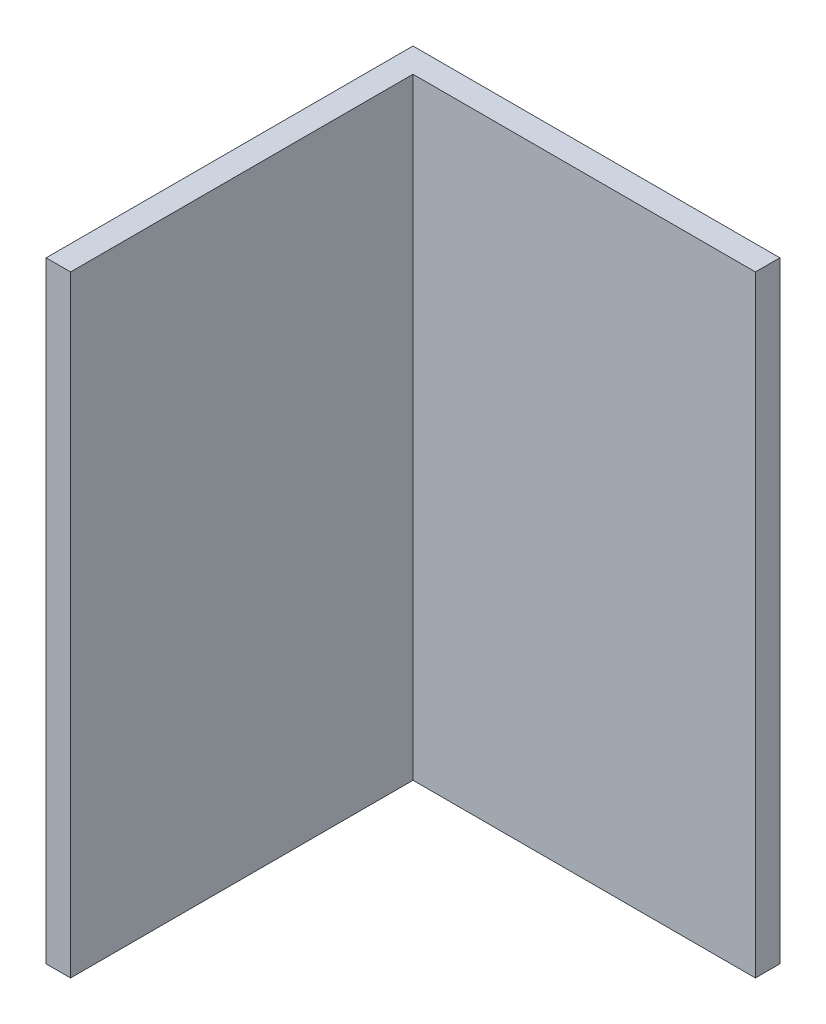
ISO-10303-21;
HEADER;
FILE_DESCRIPTION(('STEP AP214'),'2;1');
FILE_NAME('part.step','',(''),(''),'','','');
FILE_SCHEMA(('AUTOMOTIVE_DESIGN { 1 0 10303 214 1 1 1 1 }'));
ENDSEC;
DATA;
#1=APPLICATION_CONTEXT('core data for automotive mechanical design processes');
#2=APPLICATION_PROTOCOL_DEFINITION('international standard','automotive_design',2000,#1);
#3=PRODUCT_CONTEXT('',#1,'mechanical');
#4=PRODUCT('Part','Part','',(#3));
#5=PRODUCT_RELATED_PRODUCT_CATEGORY('part','',(#4));
#6=PRODUCT_DEFINITION_FORMATION('','',#4);
#7=PRODUCT_DEFINITION_CONTEXT('part definition',#1,'design');
#8=PRODUCT_DEFINITION('design','',#6,#7);
#9=PRODUCT_DEFINITION_SHAPE('','',#8);
#10=(LENGTH_UNIT() NAMED_UNIT(*) SI_UNIT(.MILLI.,.METRE.));
#11=(NAMED_UNIT(*) PLANE_ANGLE_UNIT() SI_UNIT($,.RADIAN.));
#12=(NAMED_UNIT(*) SI_UNIT($,.STERADIAN.) SOLID_ANGLE_UNIT());
#13=UNCERTAINTY_MEASURE_WITH_UNIT(LENGTH_MEASURE(1.E-05),#10,'distance_accuracy_value','');
#14=(GEOMETRIC_REPRESENTATION_CONTEXT(3) GLOBAL_UNCERTAINTY_ASSIGNED_CONTEXT((#13)) GLOBAL_UNIT_ASSIGNED_CONTEXT((#10,
#11,#12)) REPRESENTATION_CONTEXT('',''));
#15=CARTESIAN_POINT('',(0.,0.,0.));
#16=DIRECTION('',(0.,0.,1.));
#17=DIRECTION('',(1.,0.,0.));
#18=AXIS2_PLACEMENT_3D('',#15,#16,#17);
#19=CARTESIAN_POINT('',(0.,0.,2.));
#20=DIRECTION('',(0.,0.,-1.));
#21=DIRECTION('',(-1.,0.,0.));
#22=AXIS2_PLACEMENT_3D('',#19,#20,#21);
#23=PLANE('',#22);
#24=DIRECTION('',(0.,1.,0.));
#25=VECTOR('',#24,1.);
#26=CARTESIAN_POINT('',(2.,50.,2.));
#27=LINE('',#26,#25);
#28=CARTESIAN_POINT('',(2.,0.,2.));
#29=VERTEX_POINT('',#28);
#30=CARTESIAN_POINT('',(2.,50.,2.));
#31=VERTEX_POINT('',#30);
#32=EDGE_CURVE('E48',#29,#31,#27,.T.);
#33=ORIENTED_EDGE('',*,*,#32,.F.);
#34=DIRECTION('',(1.,0.,0.));
#35=VECTOR('',#34,1.);
#36=CARTESIAN_POINT('',(0.,0.,2.));
#37=LINE('',#36,#35);
#38=CARTESIAN_POINT('',(30.,0.,2.));
#39=VERTEX_POINT('',#38);
#40=EDGE_CURVE('E85',#29,#39,#37,.T.);
#41=ORIENTED_EDGE('',*,*,#40,.T.);
#42=DIRECTION('',(0.,1.,0.));
#43=VECTOR('',#42,1.);
#44=CARTESIAN_POINT('',(30.,0.,2.));
#45=LINE('',#44,#43);
#46=CARTESIAN_POINT('',(30.,50.,2.));
#47=VERTEX_POINT('',#46);
#48=EDGE_CURVE('E54',#39,#47,#45,.T.);
#49=ORIENTED_EDGE('',*,*,#48,.T.);
#50=DIRECTION('',(-1.,0.,0.));
#51=VECTOR('',#50,1.);
#52=CARTESIAN_POINT('',(0.,50.,2.));
#53=LINE('',#52,#51);
#54=EDGE_CURVE('E95',#47,#31,#53,.T.);
#55=ORIENTED_EDGE('',*,*,#54,.T.);
#56=EDGE_LOOP('',(#33,#41,#49,#55));
#57=FACE_BOUND('',#56,.T.);
#58=ADVANCED_FACE('F33',(#57),#23,.F.);
#59=CARTESIAN_POINT('',(0.,0.,2.));
#60=DIRECTION('',(1.,0.,0.));
#61=DIRECTION('',(0.,0.,-1.));
#62=AXIS2_PLACEMENT_3D('',#59,#60,#61);
#63=PLANE('',#62);
#64=DIRECTION('',(0.,-1.,0.));
#65=VECTOR('',#64,1.);
#66=CARTESIAN_POINT('',(0.,0.,0.));
#67=LINE('',#66,#65);
#68=CARTESIAN_POINT('',(0.,50.,0.));
#69=VERTEX_POINT('',#68);
#70=CARTESIAN_POINT('',(0.,0.,0.));
#71=VERTEX_POINT('',#70);
#72=EDGE_CURVE('E92',#69,#71,#67,.T.);
#73=ORIENTED_EDGE('',*,*,#72,.T.);
#74=DIRECTION('',(0.,0.,-1.));
#75=VECTOR('',#74,1.);
#76=CARTESIAN_POINT('',(0.,0.,2.));
#77=LINE('',#76,#75);
#78=CARTESIAN_POINT('',(0.,0.,30.));
#79=VERTEX_POINT('',#78);
#80=EDGE_CURVE('E11',#79,#71,#77,.T.);
#81=ORIENTED_EDGE('',*,*,#80,.F.);
#82=DIRECTION('',(0.,-1.,0.));
#83=VECTOR('',#82,1.);
#84=CARTESIAN_POINT('',(0.,50.,30.));
#85=LINE('',#84,#83);
#86=CARTESIAN_POINT('',(0.,50.,30.));
#87=VERTEX_POINT('',#86);
#88=EDGE_CURVE('E94',#87,#79,#85,.T.);
#89=ORIENTED_EDGE('',*,*,#88,.F.);
#90=DIRECTION('',(0.,0.,-1.));
#91=VECTOR('',#90,1.);
#92=CARTESIAN_POINT('',(0.,50.,2.));
#93=LINE('',#92,#91);
#94=EDGE_CURVE('E78',#87,#69,#93,.T.);
#95=ORIENTED_EDGE('',*,*,#94,.T.);
#96=EDGE_LOOP('',(#73,#81,#89,#95));
#97=FACE_BOUND('',#96,.T.);
#98=ADVANCED_FACE('F35',(#97),#63,.F.);
#99=CARTESIAN_POINT('',(0.,0.,2.));
#100=DIRECTION('',(0.,1.,0.));
#101=DIRECTION('',(0.,0.,1.));
#102=AXIS2_PLACEMENT_3D('',#99,#100,#101);
#103=PLANE('',#102);
#104=DIRECTION('',(1.,0.,0.));
#105=VECTOR('',#104,1.);
#106=CARTESIAN_POINT('',(0.,0.,0.));
#107=LINE('',#106,#105);
#108=CARTESIAN_POINT('',(30.,0.,0.));
#109=VERTEX_POINT('',#108);
#110=EDGE_CURVE('E98',#71,#109,#107,.T.);
#111=ORIENTED_EDGE('',*,*,#110,.T.);
#112=DIRECTION('',(0.,0.,-1.));
#113=VECTOR('',#112,1.);
#114=CARTESIAN_POINT('',(30.,0.,2.));
#115=LINE('',#114,#113);
#116=EDGE_CURVE('E41',#39,#109,#115,.T.);
#117=ORIENTED_EDGE('',*,*,#116,.F.);
#118=ORIENTED_EDGE('',*,*,#40,.F.);
#119=DIRECTION('',(0.,0.,-1.));
#120=VECTOR('',#119,1.);
#121=CARTESIAN_POINT('',(2.00000000000001,0.,30.));
#122=LINE('',#121,#120);
#123=CARTESIAN_POINT('',(2.00000000000001,0.,30.));
#124=VERTEX_POINT('',#123);
#125=EDGE_CURVE('E99',#124,#29,#122,.T.);
#126=ORIENTED_EDGE('',*,*,#125,.F.);
#127=DIRECTION('',(1.,0.,0.));
#128=VECTOR('',#127,1.);
#129=CARTESIAN_POINT('',(0.,0.,30.));
#130=LINE('',#129,#128);
#131=EDGE_CURVE('E119',#79,#124,#130,.T.);
#132=ORIENTED_EDGE('',*,*,#131,.F.);
#133=ORIENTED_EDGE('',*,*,#80,.T.);
#134=EDGE_LOOP('',(#111,#117,#118,#126,#132,#133));
#135=FACE_BOUND('',#134,.T.);
#136=ADVANCED_FACE('F114',(#135),#103,.F.);
#137=CARTESIAN_POINT('',(30.,0.,2.));
#138=DIRECTION('',(-1.,0.,0.));
#139=DIRECTION('',(0.,0.,1.));
#140=AXIS2_PLACEMENT_3D('',#137,#138,#139);
#141=PLANE('',#140);
#142=DIRECTION('',(0.,1.,0.));
#143=VECTOR('',#142,1.);
#144=CARTESIAN_POINT('',(30.,0.,0.));
#145=LINE('',#144,#143);
#146=CARTESIAN_POINT('',(30.,50.,0.));
#147=VERTEX_POINT('',#146);
#148=EDGE_CURVE('E86',#109,#147,#145,.T.);
#149=ORIENTED_EDGE('',*,*,#148,.T.);
#150=DIRECTION('',(0.,0.,-1.));
#151=VECTOR('',#150,1.);
#152=CARTESIAN_POINT('',(30.,50.,2.));
#153=LINE('',#152,#151);
#154=EDGE_CURVE('E81',#47,#147,#153,.T.);
#155=ORIENTED_EDGE('',*,*,#154,.F.);
#156=ORIENTED_EDGE('',*,*,#48,.F.);
#157=ORIENTED_EDGE('',*,*,#116,.T.);
#158=EDGE_LOOP('',(#149,#155,#156,#157));
#159=FACE_BOUND('',#158,.T.);
#160=ADVANCED_FACE('F112',(#159),#141,.F.);
#161=CARTESIAN_POINT('',(0.,50.,2.));
#162=DIRECTION('',(0.,-1.,0.));
#163=DIRECTION('',(0.,0.,-1.));
#164=AXIS2_PLACEMENT_3D('',#161,#162,#163);
#165=PLANE('',#164);
#166=DIRECTION('',(-1.,0.,0.));
#167=VECTOR('',#166,1.);
#168=CARTESIAN_POINT('',(0.,50.,0.));
#169=LINE('',#168,#167);
#170=EDGE_CURVE('E74',#147,#69,#169,.T.);
#171=ORIENTED_EDGE('',*,*,#170,.T.);
#172=ORIENTED_EDGE('',*,*,#94,.F.);
#173=DIRECTION('',(-1.,0.,0.));
#174=VECTOR('',#173,1.);
#175=CARTESIAN_POINT('',(0.,50.,30.));
#176=LINE('',#175,#174);
#177=CARTESIAN_POINT('',(2.,50.,30.));
#178=VERTEX_POINT('',#177);
#179=EDGE_CURVE('E133',#178,#87,#176,.T.);
#180=ORIENTED_EDGE('',*,*,#179,.F.);
#181=DIRECTION('',(0.,0.,-1.));
#182=VECTOR('',#181,1.);
#183=CARTESIAN_POINT('',(2.,50.,30.));
#184=LINE('',#183,#182);
#185=EDGE_CURVE('E103',#178,#31,#184,.T.);
#186=ORIENTED_EDGE('',*,*,#185,.T.);
#187=ORIENTED_EDGE('',*,*,#54,.F.);
#188=ORIENTED_EDGE('',*,*,#154,.T.);
#189=EDGE_LOOP('',(#171,#172,#180,#186,#187,#188));
#190=FACE_BOUND('',#189,.T.);
#191=ADVANCED_FACE('F76',(#190),#165,.F.);
#192=CARTESIAN_POINT('',(0.,0.,0.));
#193=DIRECTION('',(0.,0.,-1.));
#194=DIRECTION('',(-1.,0.,0.));
#195=AXIS2_PLACEMENT_3D('',#192,#193,#194);
#196=PLANE('',#195);
#197=ORIENTED_EDGE('',*,*,#72,.F.);
#198=ORIENTED_EDGE('',*,*,#170,.F.);
#199=ORIENTED_EDGE('',*,*,#148,.F.);
#200=ORIENTED_EDGE('',*,*,#110,.F.);
#201=EDGE_LOOP('',(#197,#198,#199,#200));
#202=FACE_BOUND('',#201,.T.);
#203=ADVANCED_FACE('F97',(#202),#196,.T.);
#204=CARTESIAN_POINT('',(2.,50.,30.));
#205=DIRECTION('',(-1.,0.,0.));
#206=DIRECTION('',(0.,-1.,0.));
#207=AXIS2_PLACEMENT_3D('',#204,#205,#206);
#208=PLANE('',#207);
#209=ORIENTED_EDGE('',*,*,#32,.T.);
#210=ORIENTED_EDGE('',*,*,#185,.F.);
#211=DIRECTION('',(0.,1.,0.));
#212=VECTOR('',#211,1.);
#213=CARTESIAN_POINT('',(2.,50.,30.));
#214=LINE('',#213,#212);
#215=EDGE_CURVE('E130',#124,#178,#214,.T.);
#216=ORIENTED_EDGE('',*,*,#215,.F.);
#217=ORIENTED_EDGE('',*,*,#125,.T.);
#218=EDGE_LOOP('',(#209,#210,#216,#217));
#219=FACE_BOUND('',#218,.T.);
#220=ADVANCED_FACE('F137',(#219),#208,.F.);
#221=CARTESIAN_POINT('',(0.,0.,30.));
#222=DIRECTION('',(0.,0.,1.));
#223=DIRECTION('',(1.,0.,0.));
#224=AXIS2_PLACEMENT_3D('',#221,#222,#223);
#225=PLANE('',#224);
#226=ORIENTED_EDGE('',*,*,#88,.T.);
#227=ORIENTED_EDGE('',*,*,#131,.T.);
#228=ORIENTED_EDGE('',*,*,#215,.T.);
#229=ORIENTED_EDGE('',*,*,#179,.T.);
#230=EDGE_LOOP('',(#226,#227,#228,#229));
#231=FACE_BOUND('',#230,.T.);
#232=ADVANCED_FACE('F132',(#231),#225,.T.);
#233=CLOSED_SHELL('',(#58,#98,#136,#160,#191,#203,#220,#232));
#234=MANIFOLD_SOLID_BREP('B2',#233);
#235=ADVANCED_BREP_SHAPE_REPRESENTATION('',(#18,#234),#14);
#236=SHAPE_DEFINITION_REPRESENTATION(#9,#235);
ENDSEC;
END-ISO-10303-21;
